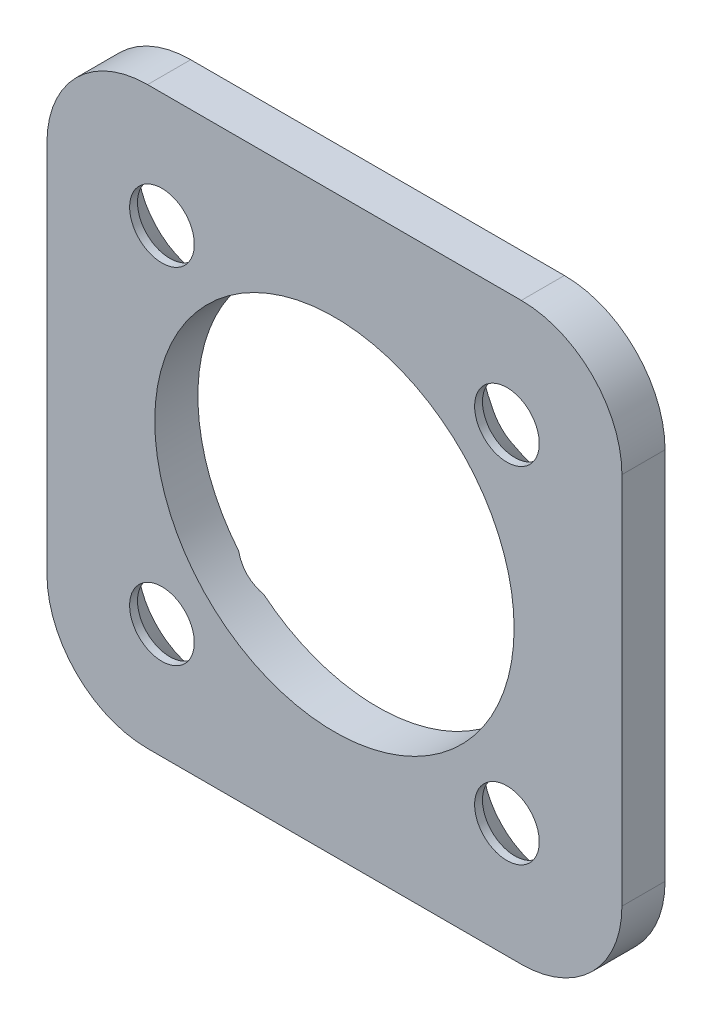
ISO-10303-21;
HEADER;
FILE_DESCRIPTION(('STEP AP214'),'2;1');
FILE_NAME('part.step','',(''),(''),'','','');
FILE_SCHEMA(('AUTOMOTIVE_DESIGN { 1 0 10303 214 1 1 1 1 }'));
ENDSEC;
DATA;
#1=APPLICATION_CONTEXT('core data for automotive mechanical design processes');
#2=APPLICATION_PROTOCOL_DEFINITION('international standard','automotive_design',2000,#1);
#3=PRODUCT_CONTEXT('',#1,'mechanical');
#4=PRODUCT('Part','Part','',(#3));
#5=PRODUCT_RELATED_PRODUCT_CATEGORY('part','',(#4));
#6=PRODUCT_DEFINITION_FORMATION('','',#4);
#7=PRODUCT_DEFINITION_CONTEXT('part definition',#1,'design');
#8=PRODUCT_DEFINITION('design','',#6,#7);
#9=PRODUCT_DEFINITION_SHAPE('','',#8);
#10=(LENGTH_UNIT() NAMED_UNIT(*) SI_UNIT(.MILLI.,.METRE.));
#11=(NAMED_UNIT(*) PLANE_ANGLE_UNIT() SI_UNIT($,.RADIAN.));
#12=(NAMED_UNIT(*) SI_UNIT($,.STERADIAN.) SOLID_ANGLE_UNIT());
#13=UNCERTAINTY_MEASURE_WITH_UNIT(LENGTH_MEASURE(1.E-05),#10,'distance_accuracy_value','');
#14=(GEOMETRIC_REPRESENTATION_CONTEXT(3) GLOBAL_UNCERTAINTY_ASSIGNED_CONTEXT((#13)) GLOBAL_UNIT_ASSIGNED_CONTEXT((#10,
#11,#12)) REPRESENTATION_CONTEXT('',''));
#15=CARTESIAN_POINT('',(0.,0.,0.));
#16=DIRECTION('',(0.,0.,1.));
#17=DIRECTION('',(1.,0.,0.));
#18=AXIS2_PLACEMENT_3D('',#15,#16,#17);
#19=CARTESIAN_POINT('',(0.,0.,0.));
#20=DIRECTION('',(0.,0.,1.));
#21=DIRECTION('',(1.,0.,0.));
#22=AXIS2_PLACEMENT_3D('',#19,#20,#21);
#23=PLANE('',#22);
#24=DIRECTION('',(0.,1.,0.));
#25=VECTOR('',#24,1.);
#26=CARTESIAN_POINT('',(-20.,0.,0.));
#27=LINE('',#26,#25);
#28=CARTESIAN_POINT('',(-20.,-13.,0.));
#29=VERTEX_POINT('',#28);
#30=CARTESIAN_POINT('',(-20.,13.,0.));
#31=VERTEX_POINT('',#30);
#32=EDGE_CURVE('E170',#29,#31,#27,.T.);
#33=ORIENTED_EDGE('',*,*,#32,.T.);
#34=CARTESIAN_POINT('',(-13.,13.,0.));
#35=DIRECTION('',(0.,0.,1.));
#36=DIRECTION('',(1.,0.,0.));
#37=AXIS2_PLACEMENT_3D('',#34,#35,#36);
#38=CIRCLE('',#37,7.);
#39=CARTESIAN_POINT('',(-13.,20.,0.));
#40=VERTEX_POINT('',#39);
#41=EDGE_CURVE('E191',#31,#40,#38,.F.);
#42=ORIENTED_EDGE('',*,*,#41,.T.);
#43=DIRECTION('',(1.,0.,0.));
#44=VECTOR('',#43,1.);
#45=CARTESIAN_POINT('',(0.,20.,0.));
#46=LINE('',#45,#44);
#47=CARTESIAN_POINT('',(13.,20.,0.));
#48=VERTEX_POINT('',#47);
#49=EDGE_CURVE('E166',#40,#48,#46,.T.);
#50=ORIENTED_EDGE('',*,*,#49,.T.);
#51=CARTESIAN_POINT('',(13.,13.,0.));
#52=DIRECTION('',(0.,0.,1.));
#53=DIRECTION('',(1.,0.,0.));
#54=AXIS2_PLACEMENT_3D('',#51,#52,#53);
#55=CIRCLE('',#54,7.);
#56=CARTESIAN_POINT('',(20.,13.,0.));
#57=VERTEX_POINT('',#56);
#58=EDGE_CURVE('E182',#48,#57,#55,.F.);
#59=ORIENTED_EDGE('',*,*,#58,.T.);
#60=DIRECTION('',(0.,1.,0.));
#61=VECTOR('',#60,1.);
#62=CARTESIAN_POINT('',(20.,0.,0.));
#63=LINE('',#62,#61);
#64=CARTESIAN_POINT('',(20.,-13.,0.));
#65=VERTEX_POINT('',#64);
#66=EDGE_CURVE('E162',#65,#57,#63,.T.);
#67=ORIENTED_EDGE('',*,*,#66,.F.);
#68=CARTESIAN_POINT('',(13.,-13.,0.));
#69=DIRECTION('',(0.,0.,1.));
#70=DIRECTION('',(1.,0.,0.));
#71=AXIS2_PLACEMENT_3D('',#68,#69,#70);
#72=CIRCLE('',#71,7.);
#73=CARTESIAN_POINT('',(13.,-20.,0.));
#74=VERTEX_POINT('',#73);
#75=EDGE_CURVE('E185',#65,#74,#72,.F.);
#76=ORIENTED_EDGE('',*,*,#75,.T.);
#77=DIRECTION('',(1.,0.,0.));
#78=VECTOR('',#77,1.);
#79=CARTESIAN_POINT('',(0.,-20.,0.));
#80=LINE('',#79,#78);
#81=CARTESIAN_POINT('',(-13.,-20.,0.));
#82=VERTEX_POINT('',#81);
#83=EDGE_CURVE('E153',#82,#74,#80,.T.);
#84=ORIENTED_EDGE('',*,*,#83,.F.);
#85=CARTESIAN_POINT('',(-13.,-13.,0.));
#86=DIRECTION('',(0.,0.,1.));
#87=DIRECTION('',(1.,0.,0.));
#88=AXIS2_PLACEMENT_3D('',#85,#86,#87);
#89=CIRCLE('',#88,7.);
#90=EDGE_CURVE('E188',#82,#29,#89,.F.);
#91=ORIENTED_EDGE('',*,*,#90,.T.);
#92=EDGE_LOOP('',(#33,#42,#50,#59,#67,#76,#84,#91));
#93=FACE_BOUND('',#92,.T.);
#94=CARTESIAN_POINT('',(0.,0.,0.));
#95=DIRECTION('',(0.,0.,1.));
#96=DIRECTION('',(1.,0.,0.));
#97=AXIS2_PLACEMENT_3D('',#94,#95,#96);
#98=CIRCLE('',#97,12.5);
#99=CARTESIAN_POINT('',(9.67418996809564,-7.91581003190437,0.));
#100=VERTEX_POINT('',#99);
#101=CARTESIAN_POINT('',(9.67418996809562,7.91581003190438,0.));
#102=VERTEX_POINT('',#101);
#103=EDGE_CURVE('E140',#100,#102,#98,.T.);
#104=ORIENTED_EDGE('',*,*,#103,.T.);
#105=CARTESIAN_POINT('',(12.,12.,0.));
#106=DIRECTION('',(0.,0.,-1.));
#107=DIRECTION('',(-1.,0.,0.));
#108=AXIS2_PLACEMENT_3D('',#105,#106,#107);
#109=CIRCLE('',#108,4.7);
#110=CARTESIAN_POINT('',(7.91581003190437,9.67418996809564,0.));
#111=VERTEX_POINT('',#110);
#112=EDGE_CURVE('E61',#111,#102,#109,.T.);
#113=ORIENTED_EDGE('',*,*,#112,.F.);
#114=CARTESIAN_POINT('',(-7.91581003190436,9.67418996809564,0.));
#115=VERTEX_POINT('',#114);
#116=EDGE_CURVE('E68',#111,#115,#98,.T.);
#117=ORIENTED_EDGE('',*,*,#116,.T.);
#118=CARTESIAN_POINT('',(-12.,12.,0.));
#119=DIRECTION('',(0.,0.,-1.));
#120=DIRECTION('',(-1.,0.,0.));
#121=AXIS2_PLACEMENT_3D('',#118,#119,#120);
#122=CIRCLE('',#121,4.7);
#123=CARTESIAN_POINT('',(-9.67418996809565,7.91581003190435,0.));
#124=VERTEX_POINT('',#123);
#125=EDGE_CURVE('E354',#124,#115,#122,.T.);
#126=ORIENTED_EDGE('',*,*,#125,.F.);
#127=CARTESIAN_POINT('',(-9.67418996809564,-7.91581003190436,0.));
#128=VERTEX_POINT('',#127);
#129=EDGE_CURVE('E149',#124,#128,#98,.T.);
#130=ORIENTED_EDGE('',*,*,#129,.T.);
#131=CARTESIAN_POINT('',(-12.,-12.,0.));
#132=DIRECTION('',(0.,0.,-1.));
#133=DIRECTION('',(-1.,0.,0.));
#134=AXIS2_PLACEMENT_3D('',#131,#132,#133);
#135=CIRCLE('',#134,4.7);
#136=CARTESIAN_POINT('',(-7.91581003190435,-9.67418996809565,0.));
#137=VERTEX_POINT('',#136);
#138=EDGE_CURVE('E342',#137,#128,#135,.T.);
#139=ORIENTED_EDGE('',*,*,#138,.F.);
#140=CARTESIAN_POINT('',(7.91581003190437,-9.67418996809563,0.));
#141=VERTEX_POINT('',#140);
#142=EDGE_CURVE('E154',#137,#141,#98,.T.);
#143=ORIENTED_EDGE('',*,*,#142,.T.);
#144=CARTESIAN_POINT('',(12.,-12.,0.));
#145=DIRECTION('',(0.,0.,-1.));
#146=DIRECTION('',(-1.,0.,0.));
#147=AXIS2_PLACEMENT_3D('',#144,#145,#146);
#148=CIRCLE('',#147,4.7);
#149=EDGE_CURVE('E330',#100,#141,#148,.T.);
#150=ORIENTED_EDGE('',*,*,#149,.F.);
#151=EDGE_LOOP('',(#104,#113,#117,#126,#130,#139,#143,#150));
#152=FACE_BOUND('',#151,.T.);
#153=ADVANCED_FACE('F41',(#93,#152),#23,.F.);
#154=CARTESIAN_POINT('',(0.,-20.,3.));
#155=DIRECTION('',(0.,1.,0.));
#156=DIRECTION('',(0.,0.,1.));
#157=AXIS2_PLACEMENT_3D('',#154,#155,#156);
#158=PLANE('',#157);
#159=DIRECTION('',(1.,0.,0.));
#160=VECTOR('',#159,1.);
#161=CARTESIAN_POINT('',(0.,-20.,3.));
#162=LINE('',#161,#160);
#163=CARTESIAN_POINT('',(-13.,-20.,3.));
#164=VERTEX_POINT('',#163);
#165=CARTESIAN_POINT('',(13.,-20.,3.));
#166=VERTEX_POINT('',#165);
#167=EDGE_CURVE('E281',#164,#166,#162,.T.);
#168=ORIENTED_EDGE('',*,*,#167,.F.);
#169=DIRECTION('',(0.,0.,-1.));
#170=VECTOR('',#169,1.);
#171=CARTESIAN_POINT('',(-13.,-20.,0.));
#172=LINE('',#171,#170);
#173=EDGE_CURVE('E216',#164,#82,#172,.T.);
#174=ORIENTED_EDGE('',*,*,#173,.T.);
#175=ORIENTED_EDGE('',*,*,#83,.T.);
#176=DIRECTION('',(0.,0.,-1.));
#177=VECTOR('',#176,1.);
#178=CARTESIAN_POINT('',(13.,-20.,3.));
#179=LINE('',#178,#177);
#180=EDGE_CURVE('E213',#74,#166,#179,.F.);
#181=ORIENTED_EDGE('',*,*,#180,.T.);
#182=EDGE_LOOP('',(#168,#174,#175,#181));
#183=FACE_BOUND('',#182,.T.);
#184=ADVANCED_FACE('F263',(#183),#158,.F.);
#185=CARTESIAN_POINT('',(20.,0.,3.));
#186=DIRECTION('',(-1.,0.,0.));
#187=DIRECTION('',(0.,0.,1.));
#188=AXIS2_PLACEMENT_3D('',#185,#186,#187);
#189=PLANE('',#188);
#190=DIRECTION('',(0.,1.,0.));
#191=VECTOR('',#190,1.);
#192=CARTESIAN_POINT('',(20.,0.,3.));
#193=LINE('',#192,#191);
#194=CARTESIAN_POINT('',(20.,-13.,3.));
#195=VERTEX_POINT('',#194);
#196=CARTESIAN_POINT('',(20.,13.,3.));
#197=VERTEX_POINT('',#196);
#198=EDGE_CURVE('E288',#195,#197,#193,.T.);
#199=ORIENTED_EDGE('',*,*,#198,.F.);
#200=DIRECTION('',(0.,0.,-1.));
#201=VECTOR('',#200,1.);
#202=CARTESIAN_POINT('',(20.,-13.,3.));
#203=LINE('',#202,#201);
#204=EDGE_CURVE('E223',#195,#65,#203,.T.);
#205=ORIENTED_EDGE('',*,*,#204,.T.);
#206=ORIENTED_EDGE('',*,*,#66,.T.);
#207=DIRECTION('',(0.,0.,-1.));
#208=VECTOR('',#207,1.);
#209=CARTESIAN_POINT('',(20.,13.,3.));
#210=LINE('',#209,#208);
#211=EDGE_CURVE('E220',#57,#197,#210,.F.);
#212=ORIENTED_EDGE('',*,*,#211,.T.);
#213=EDGE_LOOP('',(#199,#205,#206,#212));
#214=FACE_BOUND('',#213,.T.);
#215=ADVANCED_FACE('F271',(#214),#189,.F.);
#216=CARTESIAN_POINT('',(0.,20.,3.));
#217=DIRECTION('',(0.,1.,0.));
#218=DIRECTION('',(0.,0.,1.));
#219=AXIS2_PLACEMENT_3D('',#216,#217,#218);
#220=PLANE('',#219);
#221=ORIENTED_EDGE('',*,*,#49,.F.);
#222=DIRECTION('',(0.,0.,-1.));
#223=VECTOR('',#222,1.);
#224=CARTESIAN_POINT('',(-13.,20.,3.));
#225=LINE('',#224,#223);
#226=CARTESIAN_POINT('',(-13.,20.,3.));
#227=VERTEX_POINT('',#226);
#228=EDGE_CURVE('E198',#40,#227,#225,.F.);
#229=ORIENTED_EDGE('',*,*,#228,.T.);
#230=DIRECTION('',(1.,0.,0.));
#231=VECTOR('',#230,1.);
#232=CARTESIAN_POINT('',(0.,20.,3.));
#233=LINE('',#232,#231);
#234=CARTESIAN_POINT('',(13.,20.,3.));
#235=VERTEX_POINT('',#234);
#236=EDGE_CURVE('E305',#227,#235,#233,.T.);
#237=ORIENTED_EDGE('',*,*,#236,.T.);
#238=DIRECTION('',(0.,0.,-1.));
#239=VECTOR('',#238,1.);
#240=CARTESIAN_POINT('',(13.,20.,0.));
#241=LINE('',#240,#239);
#242=EDGE_CURVE('E194',#235,#48,#241,.T.);
#243=ORIENTED_EDGE('',*,*,#242,.T.);
#244=EDGE_LOOP('',(#221,#229,#237,#243));
#245=FACE_BOUND('',#244,.T.);
#246=ADVANCED_FACE('F268',(#245),#220,.T.);
#247=CARTESIAN_POINT('',(0.,0.,3.));
#248=DIRECTION('',(0.,0.,-1.));
#249=DIRECTION('',(-1.,0.,0.));
#250=AXIS2_PLACEMENT_3D('',#247,#248,#249);
#251=CYLINDRICAL_SURFACE('',#250,12.5);
#252=CARTESIAN_POINT('',(10.8006047846748,6.29260965619672,-1.13205396229184));
#253=CARTESIAN_POINT('',(10.7645172292087,6.35454761223525,-1.07886654106556));
#254=CARTESIAN_POINT('',(10.7276604779168,6.41658620080491,-1.02632212757593));
#255=CARTESIAN_POINT('',(10.6522958441881,6.54093932193887,-0.922725032695068));
#256=CARTESIAN_POINT('',(10.6137875103378,6.60325392571683,-0.871672765634166));
#257=CARTESIAN_POINT('',(10.4952550795433,6.79129330640606,-0.720607779526519));
#258=CARTESIAN_POINT('',(10.4125800478102,6.91749930457328,-0.623219889186378));
#259=CARTESIAN_POINT('',(10.2400977072329,7.17032889068553,-0.438888652324929));
#260=CARTESIAN_POINT('',(10.1503645429114,7.29693746721305,-0.351855934719834));
#261=CARTESIAN_POINT('',(9.96223494712116,7.55174402889875,-0.190905891144072));
#262=CARTESIAN_POINT('',(9.86386003391623,7.67993741952499,-0.116957297053382));
#263=CARTESIAN_POINT('',(9.73241664500092,7.84424265007866,-0.033973245157395));
#264=CARTESIAN_POINT('',(9.70366995167949,7.87977970409186,-0.0167234618062224));
#265=CARTESIAN_POINT('',(9.55693054819715,8.05912407480012,0.0665191467279399));
#266=CARTESIAN_POINT('',(9.43311103608502,8.20388608625827,0.121396218316169));
#267=CARTESIAN_POINT('',(9.2392452401968,8.41996277323248,0.180112268994139));
#268=CARTESIAN_POINT('',(9.17323507635609,8.49184333589452,0.195752777982601));
#269=CARTESIAN_POINT('',(9.03883776209829,8.6347559452018,0.218495263505952));
#270=CARTESIAN_POINT('',(8.97045104923066,8.70578814483821,0.225598803313324));
#271=CARTESIAN_POINT('',(8.83152776375289,8.84669175364472,0.230912959288517));
#272=CARTESIAN_POINT('',(8.76098287354356,8.9165564678845,0.229083249510996));
#273=CARTESIAN_POINT('',(8.61864915044469,9.05420842154312,0.216535244463097));
#274=CARTESIAN_POINT('',(8.5468600796403,9.12199525660842,0.205815230391567));
#275=CARTESIAN_POINT('',(8.40269099310056,9.25496636466527,0.176014739641296));
#276=CARTESIAN_POINT('',(8.33031121259788,9.32015161805615,0.15693744546944));
#277=CARTESIAN_POINT('',(8.18541971590156,9.44765677551576,0.111243867083364));
#278=CARTESIAN_POINT('',(8.1129080001486,9.50997668913708,0.0846276080050394));
#279=CARTESIAN_POINT('',(8.01963397280548,9.58833753332281,0.0461029241292335));
#280=CARTESIAN_POINT('',(7.99875125529021,9.60576459594413,0.0372000670154303));
#281=CARTESIAN_POINT('',(7.95703437163372,9.64034942818812,0.0188812289150323));
#282=CARTESIAN_POINT('',(7.93620017729589,9.65750749493711,0.00946587431207679));
#283=CARTESIAN_POINT('',(7.80422426483353,9.76548547980875,-0.0518020888920344));
#284=CARTESIAN_POINT('',(7.69344435594022,9.8529218449894,-0.110544111463963));
#285=CARTESIAN_POINT('',(7.47301837942981,10.0211418637569,-0.239057454103525));
#286=CARTESIAN_POINT('',(7.36337492063897,10.1019123167037,-0.308849896322763));
#287=CARTESIAN_POINT('',(7.14451278579196,10.2578812798489,-0.45733413510473));
#288=CARTESIAN_POINT('',(7.03530416636305,10.3330311827916,-0.536091365536578));
#289=CARTESIAN_POINT('',(6.87256513782397,10.4413633864377,-0.65886078669061));
#290=CARTESIAN_POINT('',(6.81860419393717,10.4766760187053,-0.700468739083402));
#291=CARTESIAN_POINT('',(6.71094124331328,10.545964164327,-0.785076273703849));
#292=CARTESIAN_POINT('',(6.65723917598595,10.5799400053682,-0.828075510117313));
#293=CARTESIAN_POINT('',(6.60364071568188,10.6132902201998,-0.871683546186012));
#294=B_SPLINE_CURVE_WITH_KNOTS('',3,(#252,#253,#254,#255,#256,#257,#258,#259,#260,#261,#262,
#263,#264,#265,#266,#267,#268,#269,#270,#271,#272,#273,#274,#275,#276,#277,#278,#279,#280,#281,
#282,#283,#284,#285,#286,#287,#288,#289,#290,#291,#292,#293),.UNSPECIFIED.,.F.,.F.,(4,2,2,2,2,2,
2,2,2,2,2,2,2,2,2,2,2,2,2,2,4),(0.,0.267769444558758,0.535612548663542,1.0739597192657,
1.60725907509447,2.13926622603962,2.2858391566638,2.8776776575702,3.1738687207185,
3.47000553769171,3.76748039061873,4.06501276906259,4.36243194358922,4.65985012649311,
4.74570428330606,4.83145576614648,5.2892473219753,5.74792472159905,6.21019537634768,
6.44041543203432,6.6705786978434),.UNSPECIFIED.);
#295=EDGE_CURVE('E11',#102,#111,#294,.T.);
#296=ORIENTED_EDGE('',*,*,#295,.F.);
#297=ORIENTED_EDGE('',*,*,#103,.F.);
#298=CARTESIAN_POINT('',(6.29260965619673,-10.8006047846748,-1.13205396229184));
#299=CARTESIAN_POINT('',(6.35454761223525,-10.7645172292087,-1.07886654106556));
#300=CARTESIAN_POINT('',(6.41658620080491,-10.7276604779168,-1.02632212757593));
#301=CARTESIAN_POINT('',(6.54093932193887,-10.6522958441881,-0.922725032695074));
#302=CARTESIAN_POINT('',(6.60325392571682,-10.6137875103378,-0.871672765634173));
#303=CARTESIAN_POINT('',(6.79129330640605,-10.4952550795433,-0.72060777952653));
#304=CARTESIAN_POINT('',(6.91749930457326,-10.4125800478103,-0.623219889186392));
#305=CARTESIAN_POINT('',(7.17032889068551,-10.2400977072329,-0.438888652324943));
#306=CARTESIAN_POINT('',(7.29693746721303,-10.1503645429114,-0.351855934719844));
#307=CARTESIAN_POINT('',(7.55174402889874,-9.96223494712117,-0.190905891144075));
#308=CARTESIAN_POINT('',(7.67993741952499,-9.86386003391623,-0.11695729705338));
#309=CARTESIAN_POINT('',(7.84424265007917,-9.73241664500051,-0.0339732451571383));
#310=CARTESIAN_POINT('',(7.87977970409287,-9.70366995167867,-0.0167234618057314));
#311=CARTESIAN_POINT('',(8.05912407480158,-9.55693054819591,0.0665191467285314));
#312=CARTESIAN_POINT('',(8.20388608625967,-9.4331110360838,0.121396218316646));
#313=CARTESIAN_POINT('',(8.41996277323378,-9.23924524019561,0.180112268994445));
#314=CARTESIAN_POINT('',(8.49184333589579,-9.17323507635491,0.195752777982851));
#315=CARTESIAN_POINT('',(8.63475594520299,-9.03883776209715,0.218495263506095));
#316=CARTESIAN_POINT('',(8.70578814483936,-8.97045104922954,0.225598803313416));
#317=CARTESIAN_POINT('',(8.8466917536458,-8.83152776375181,0.230912959288514));
#318=CARTESIAN_POINT('',(8.91655646788554,-8.7609828735425,0.229083249510948));
#319=CARTESIAN_POINT('',(9.05420842154407,-8.61864915044369,0.216535244462969));
#320=CARTESIAN_POINT('',(9.12199525660933,-8.54686007963932,0.205815230391403));
#321=CARTESIAN_POINT('',(9.2549663646661,-8.40269099309964,0.176014739641073));
#322=CARTESIAN_POINT('',(9.32015161805694,-8.330311212597,0.156937445469193));
#323=CARTESIAN_POINT('',(9.44765677551646,-8.18541971590074,0.111243867083081));
#324=CARTESIAN_POINT('',(9.50997668913775,-8.11290800014782,0.0846276080047441));
#325=CARTESIAN_POINT('',(9.58833753332312,-8.01963397280511,0.0461029241290772));
#326=CARTESIAN_POINT('',(9.60576459594412,-7.99875125529022,0.0372000670154328));
#327=CARTESIAN_POINT('',(9.64034942818749,-7.95703437163447,0.018881228915372));
#328=CARTESIAN_POINT('',(9.65750749493618,-7.93620017729703,0.00946587431259486));
#329=CARTESIAN_POINT('',(9.76548547980765,-7.80422426483493,-0.0518020888913197));
#330=CARTESIAN_POINT('',(9.85292184498842,-7.69344435594149,-0.110544111463262));
#331=CARTESIAN_POINT('',(10.0211418637561,-7.47301837943083,-0.239057454102888));
#332=CARTESIAN_POINT('',(10.101912316703,-7.36337492063986,-0.308849896322177));
#333=CARTESIAN_POINT('',(10.2578812798484,-7.14451278579259,-0.457334135104275));
#334=CARTESIAN_POINT('',(10.3330311827912,-7.03530416636355,-0.536091365536203));
#335=CARTESIAN_POINT('',(10.4413633864375,-6.87256513782428,-0.658860786690367));
#336=CARTESIAN_POINT('',(10.4766760187051,-6.81860419393742,-0.700468739083205));
#337=CARTESIAN_POINT('',(10.545964164327,-6.7109412433134,-0.785076273703746));
#338=CARTESIAN_POINT('',(10.5799400053682,-6.65723917598601,-0.828075510117259));
#339=CARTESIAN_POINT('',(10.6132902201998,-6.60364071568188,-0.871683546186009));
#340=B_SPLINE_CURVE_WITH_KNOTS('',3,(#298,#299,#300,#301,#302,#303,#304,#305,#306,#307,#308,
#309,#310,#311,#312,#313,#314,#315,#316,#317,#318,#319,#320,#321,#322,#323,#324,#325,#326,#327,
#328,#329,#330,#331,#332,#333,#334,#335,#336,#337,#338,#339),.UNSPECIFIED.,.F.,.F.,(4,2,2,2,2,2,
2,2,2,2,2,2,2,2,2,2,2,2,2,2,4),(0.,0.267769444558748,0.535612548663522,1.07395971926567,
1.60725907509445,2.13926622603962,2.28583915666588,2.87767765757203,3.17386872072019,
3.47000553769328,3.76748039062016,4.06501276906388,4.36243194359038,4.65985012649413,
4.74570428330553,4.8314557661444,5.28924732197372,5.74792472159797,6.21019537634715,
6.44041543203405,6.6705786978434),.UNSPECIFIED.);
#341=EDGE_CURVE('E227',#141,#100,#340,.T.);
#342=ORIENTED_EDGE('',*,*,#341,.F.);
#343=ORIENTED_EDGE('',*,*,#142,.F.);
#344=CARTESIAN_POINT('',(-10.8006047846748,-6.29260965619672,-1.13205396229184));
#345=CARTESIAN_POINT('',(-10.7645172292087,-6.35454761223525,-1.07886654106556));
#346=CARTESIAN_POINT('',(-10.7276604779168,-6.41658620080491,-1.02632212757593));
#347=CARTESIAN_POINT('',(-10.6522958441881,-6.54093932193886,-0.922725032695071));
#348=CARTESIAN_POINT('',(-10.6137875103378,-6.60325392571682,-0.87167276563417));
#349=CARTESIAN_POINT('',(-10.4952550795433,-6.79129330640605,-0.720607779526527));
#350=CARTESIAN_POINT('',(-10.4125800478103,-6.91749930457325,-0.62321988918639));
#351=CARTESIAN_POINT('',(-10.2400977072329,-7.1703288906855,-0.438888652324939));
#352=CARTESIAN_POINT('',(-10.1503645429114,-7.29693746721303,-0.351855934719839));
#353=CARTESIAN_POINT('',(-9.96223494712117,-7.55174402889874,-0.19090589114407));
#354=CARTESIAN_POINT('',(-9.86386003391623,-7.67993741952499,-0.116957297053377));
#355=CARTESIAN_POINT('',(-9.73241664500052,-7.84424265007916,-0.0339732451571359));
#356=CARTESIAN_POINT('',(-9.70366995167868,-7.87977970409286,-0.01672346180573));
#357=CARTESIAN_POINT('',(-9.55693054819593,-8.05912407480157,0.0665191467285333));
#358=CARTESIAN_POINT('',(-9.43311103608381,-8.20388608625966,0.121396218316649));
#359=CARTESIAN_POINT('',(-9.23924524019562,-8.41996277323377,0.180112268994449));
#360=CARTESIAN_POINT('',(-9.17323507635492,-8.49184333589577,0.195752777982855));
#361=CARTESIAN_POINT('',(-9.03883776209716,-8.63475594520298,0.218495263506101));
#362=CARTESIAN_POINT('',(-8.97045104922955,-8.70578814483935,0.225598803313424));
#363=CARTESIAN_POINT('',(-8.83152776375182,-8.84669175364579,0.230912959288523));
#364=CARTESIAN_POINT('',(-8.76098287354251,-8.91655646788553,0.229083249510956));
#365=CARTESIAN_POINT('',(-8.6186491504437,-9.05420842154406,0.216535244462978));
#366=CARTESIAN_POINT('',(-8.54686007963933,-9.12199525660933,0.205815230391412));
#367=CARTESIAN_POINT('',(-8.40269099309965,-9.25496636466609,0.176014739641083));
#368=CARTESIAN_POINT('',(-8.33031121259701,-9.32015161805693,0.156937445469202));
#369=CARTESIAN_POINT('',(-8.18541971590075,-9.44765677551645,0.11124386708309));
#370=CARTESIAN_POINT('',(-8.11290800014782,-9.50997668913774,0.0846276080047517));
#371=CARTESIAN_POINT('',(-8.01963397280512,-9.58833753332311,0.0461029241290847));
#372=CARTESIAN_POINT('',(-7.99875125529022,-9.60576459594413,0.0372000670154392));
#373=CARTESIAN_POINT('',(-7.95703437163447,-9.6403494281875,0.0188812289153757));
#374=CARTESIAN_POINT('',(-7.93620017729702,-9.65750749493619,0.00946587431259699));
#375=CARTESIAN_POINT('',(-7.80422426483491,-9.76548547980766,-0.0518020888913176));
#376=CARTESIAN_POINT('',(-7.69344435594148,-9.85292184498843,-0.11054411146326));
#377=CARTESIAN_POINT('',(-7.47301837943082,-10.0211418637561,-0.239057454102885));
#378=CARTESIAN_POINT('',(-7.36337492063986,-10.101912316703,-0.308849896322172));
#379=CARTESIAN_POINT('',(-7.1445127857926,-10.2578812798484,-0.457334135104267));
#380=CARTESIAN_POINT('',(-7.03530416636355,-10.3330311827912,-0.536091365536194));
#381=CARTESIAN_POINT('',(-6.87256513782428,-10.4413633864375,-0.658860786690358));
#382=CARTESIAN_POINT('',(-6.81860419393743,-10.4766760187051,-0.700468739083194));
#383=CARTESIAN_POINT('',(-6.71094124331341,-10.545964164327,-0.785076273703735));
#384=CARTESIAN_POINT('',(-6.65723917598602,-10.5799400053682,-0.828075510117248));
#385=CARTESIAN_POINT('',(-6.60364071568189,-10.6132902201998,-0.871683546185998));
#386=B_SPLINE_CURVE_WITH_KNOTS('',3,(#344,#345,#346,#347,#348,#349,#350,#351,#352,#353,#354,
#355,#356,#357,#358,#359,#360,#361,#362,#363,#364,#365,#366,#367,#368,#369,#370,#371,#372,#373,
#374,#375,#376,#377,#378,#379,#380,#381,#382,#383,#384,#385),.UNSPECIFIED.,.F.,.F.,(4,2,2,2,2,2,
2,2,2,2,2,2,2,2,2,2,2,2,2,2,4),(0.,0.26776944455875,0.535612548663525,1.07395971926567,
1.60725907509445,2.13926622603962,2.28583915666587,2.87767765757201,3.17386872072018,
3.47000553769327,3.76748039062015,4.06501276906388,4.36243194359037,4.65985012649413,
4.74570428330554,4.83145576614443,5.28924732197373,5.74792472159798,6.21019537634715,
6.44041543203405,6.6705786978434),.UNSPECIFIED.);
#387=EDGE_CURVE('E235',#128,#137,#386,.T.);
#388=ORIENTED_EDGE('',*,*,#387,.F.);
#389=ORIENTED_EDGE('',*,*,#129,.F.);
#390=CARTESIAN_POINT('',(-6.60364071568189,10.6132902201998,-0.871683546185998));
#391=CARTESIAN_POINT('',(-6.65648309257449,10.5804105275721,-0.828690482268786));
#392=CARTESIAN_POINT('',(-6.70942657567931,10.5469223813527,-0.786289101982085));
#393=CARTESIAN_POINT('',(-6.81556344746717,10.4786488326951,-0.702836694597583));
#394=CARTESIAN_POINT('',(-6.86875688853872,10.4438631466412,-0.661785966459064));
#395=CARTESIAN_POINT('',(-7.0291338317676,10.3372052099081,-0.540647555309464));
#396=CARTESIAN_POINT('',(-7.13673289258125,10.263268424003,-0.46288669755904));
#397=CARTESIAN_POINT('',(-7.35547838934832,10.1076868850598,-0.313950042668184));
#398=CARTESIAN_POINT('',(-7.46665178386171,10.0259124720208,-0.242947679699083));
#399=CARTESIAN_POINT('',(-7.69020339110584,9.85547936469637,-0.112263411727003));
#400=CARTESIAN_POINT('',(-7.80257952152483,9.76683129631872,-0.0525645059133385));
#401=CARTESIAN_POINT('',(-7.98755793817569,9.61548831302981,0.0333072689453376));
#402=CARTESIAN_POINT('',(-8.05991013513959,9.55494340402944,0.0638114459492611));
#403=CARTESIAN_POINT('',(-8.20471866090258,9.43088947544502,0.117845992881713));
#404=CARTESIAN_POINT('',(-8.27717499240459,9.36738037752488,0.141376178384161));
#405=CARTESIAN_POINT('',(-8.4212546169749,9.23806100681818,0.180397548125066));
#406=CARTESIAN_POINT('',(-8.49288016465709,9.17227039389944,0.195944911608852));
#407=CARTESIAN_POINT('',(-8.6352745766849,9.03833956726141,0.218550412560006));
#408=CARTESIAN_POINT('',(-8.70604352843981,8.97019959605466,0.225609423554922));
#409=CARTESIAN_POINT('',(-8.84664276180074,8.83157572334244,0.230910115681913));
#410=CARTESIAN_POINT('',(-8.91646205930959,8.76107809951336,0.229085433520706));
#411=CARTESIAN_POINT('',(-9.05402139685334,8.61884492541822,0.216558704276857));
#412=CARTESIAN_POINT('',(-9.12176113645749,8.54710919860207,0.205855380710107));
#413=CARTESIAN_POINT('',(-9.25473395670787,8.40294767768801,0.176079113787939));
#414=CARTESIAN_POINT('',(-9.31996451384077,8.33052127581736,0.156997972379072));
#415=CARTESIAN_POINT('',(-9.44756162742581,8.18553038727254,0.111284478892811));
#416=CARTESIAN_POINT('',(-9.50992785211949,8.1129658856117,0.0846512546529946));
#417=CARTESIAN_POINT('',(-9.60586940753196,7.99876567536752,0.0374839064127333));
#418=CARTESIAN_POINT('',(-9.64045259335995,7.95704567788027,0.019143244762254));
#419=CARTESIAN_POINT('',(-9.773380053265,7.79457462675045,-0.0562822027400511));
#420=CARTESIAN_POINT('',(-9.86807127116196,7.67421949286466,-0.12079215959718));
#421=CARTESIAN_POINT('',(-10.0495918323108,7.43493987077943,-0.262485490505353));
#422=CARTESIAN_POINT('',(-10.1364089872238,7.31601783953233,-0.339688008982758));
#423=CARTESIAN_POINT('',(-10.3031920080088,7.07921440509509,-0.503749139626326));
#424=CARTESIAN_POINT('',(-10.3831304160567,6.96133871739857,-0.590643534457893));
#425=CARTESIAN_POINT('',(-10.5365331945134,6.7268925211102,-0.771375200047997));
#426=CARTESIAN_POINT('',(-10.6100013467582,6.61032128532682,-0.865208355326412));
#427=CARTESIAN_POINT('',(-10.7010996933186,6.46049682633936,-0.989681299072999));
#428=CARTESIAN_POINT('',(-10.721362028711,6.42681324485396,-1.01791957366328));
#429=CARTESIAN_POINT('',(-10.7613589181505,6.35961318073734,-1.07472703808372));
#430=CARTESIAN_POINT('',(-10.7810948306446,6.32609649668098,-1.1032950328399));
#431=CARTESIAN_POINT('',(-10.8006047846748,6.29260965619672,-1.13205396229183));
#432=B_SPLINE_CURVE_WITH_KNOTS('',3,(#390,#391,#392,#393,#394,#395,#396,#397,#398,#399,#400,
#401,#402,#403,#404,#405,#406,#407,#408,#409,#410,#411,#412,#413,#414,#415,#416,#417,#418,#419,
#420,#421,#422,#423,#424,#425,#426,#427,#428,#429,#430,#431),.UNSPECIFIED.,.F.,.F.,(4,2,2,2,2,2,
2,2,2,2,2,2,2,2,2,2,2,2,2,2,4),(0.,0.226917936639701,0.453885766940444,0.909460064498366,
1.37464095258264,1.83911653520639,2.13632755618446,2.43354643615889,2.72864393206697,
3.02371105719824,3.32098577090798,3.61830323127364,3.91591228018489,4.21355571288429,
4.38515252990949,4.88266613738527,5.38093715682042,5.88111283329582,6.38099419164863,
6.52619177623077,6.67096889379309),.UNSPECIFIED.);
#433=EDGE_CURVE('E56',#115,#124,#432,.T.);
#434=ORIENTED_EDGE('',*,*,#433,.F.);
#435=ORIENTED_EDGE('',*,*,#116,.F.);
#436=EDGE_LOOP('',(#296,#297,#342,#343,#388,#389,#434,#435));
#437=FACE_BOUND('',#436,.T.);
#438=CARTESIAN_POINT('',(0.,0.,3.));
#439=DIRECTION('',(0.,0.,1.));
#440=DIRECTION('',(1.,0.,0.));
#441=AXIS2_PLACEMENT_3D('',#438,#439,#440);
#442=CIRCLE('',#441,12.5);
#443=CARTESIAN_POINT('',(12.5,0.,3.));
#444=VERTEX_POINT('',#443);
#445=EDGE_CURVE('E174',#444,#444,#442,.T.);
#446=ORIENTED_EDGE('',*,*,#445,.T.);
#447=EDGE_LOOP('',(#446));
#448=FACE_BOUND('',#447,.T.);
#449=ADVANCED_FACE('F145',(#437,#448),#251,.F.);
#450=CARTESIAN_POINT('',(-20.,0.,3.));
#451=DIRECTION('',(-1.,0.,0.));
#452=DIRECTION('',(0.,0.,1.));
#453=AXIS2_PLACEMENT_3D('',#450,#451,#452);
#454=PLANE('',#453);
#455=DIRECTION('',(0.,1.,0.));
#456=VECTOR('',#455,1.);
#457=CARTESIAN_POINT('',(-20.,0.,3.));
#458=LINE('',#457,#456);
#459=CARTESIAN_POINT('',(-20.,-13.,3.));
#460=VERTEX_POINT('',#459);
#461=CARTESIAN_POINT('',(-20.,13.,3.));
#462=VERTEX_POINT('',#461);
#463=EDGE_CURVE('E157',#460,#462,#458,.T.);
#464=ORIENTED_EDGE('',*,*,#463,.T.);
#465=DIRECTION('',(0.,0.,-1.));
#466=VECTOR('',#465,1.);
#467=CARTESIAN_POINT('',(-20.,13.,3.));
#468=LINE('',#467,#466);
#469=EDGE_CURVE('E178',#462,#31,#468,.T.);
#470=ORIENTED_EDGE('',*,*,#469,.T.);
#471=ORIENTED_EDGE('',*,*,#32,.F.);
#472=DIRECTION('',(0.,0.,-1.));
#473=VECTOR('',#472,1.);
#474=CARTESIAN_POINT('',(-20.,-13.,3.));
#475=LINE('',#474,#473);
#476=EDGE_CURVE('E175',#29,#460,#475,.F.);
#477=ORIENTED_EDGE('',*,*,#476,.T.);
#478=EDGE_LOOP('',(#464,#470,#471,#477));
#479=FACE_BOUND('',#478,.T.);
#480=ADVANCED_FACE('F259',(#479),#454,.T.);
#481=CARTESIAN_POINT('',(0.,0.,3.));
#482=DIRECTION('',(0.,0.,1.));
#483=DIRECTION('',(1.,0.,0.));
#484=AXIS2_PLACEMENT_3D('',#481,#482,#483);
#485=PLANE('',#484);
#486=CARTESIAN_POINT('',(12.,12.,3.));
#487=DIRECTION('',(0.,0.,-1.));
#488=DIRECTION('',(-1.,0.,0.));
#489=AXIS2_PLACEMENT_3D('',#486,#487,#488);
#490=CIRCLE('',#489,2.25);
#491=CARTESIAN_POINT('',(9.75000000000001,12.,3.));
#492=VERTEX_POINT('',#491);
#493=EDGE_CURVE('E357',#492,#492,#490,.T.);
#494=ORIENTED_EDGE('',*,*,#493,.T.);
#495=EDGE_LOOP('',(#494));
#496=FACE_BOUND('',#495,.T.);
#497=CARTESIAN_POINT('',(-12.,12.,3.));
#498=DIRECTION('',(0.,0.,-1.));
#499=DIRECTION('',(-1.,0.,0.));
#500=AXIS2_PLACEMENT_3D('',#497,#498,#499);
#501=CIRCLE('',#500,2.25);
#502=CARTESIAN_POINT('',(-14.25,12.,3.));
#503=VERTEX_POINT('',#502);
#504=EDGE_CURVE('E346',#503,#503,#501,.T.);
#505=ORIENTED_EDGE('',*,*,#504,.T.);
#506=EDGE_LOOP('',(#505));
#507=FACE_BOUND('',#506,.T.);
#508=CARTESIAN_POINT('',(-12.,-12.,3.));
#509=DIRECTION('',(0.,0.,-1.));
#510=DIRECTION('',(-1.,0.,0.));
#511=AXIS2_PLACEMENT_3D('',#508,#509,#510);
#512=CIRCLE('',#511,2.25);
#513=CARTESIAN_POINT('',(-14.25,-12.,3.));
#514=VERTEX_POINT('',#513);
#515=EDGE_CURVE('E334',#514,#514,#512,.T.);
#516=ORIENTED_EDGE('',*,*,#515,.T.);
#517=EDGE_LOOP('',(#516));
#518=FACE_BOUND('',#517,.T.);
#519=CARTESIAN_POINT('',(12.,-12.,3.));
#520=DIRECTION('',(0.,0.,-1.));
#521=DIRECTION('',(-1.,0.,0.));
#522=AXIS2_PLACEMENT_3D('',#519,#520,#521);
#523=CIRCLE('',#522,2.25);
#524=CARTESIAN_POINT('',(9.75000000000001,-12.,3.));
#525=VERTEX_POINT('',#524);
#526=EDGE_CURVE('E322',#525,#525,#523,.T.);
#527=ORIENTED_EDGE('',*,*,#526,.T.);
#528=EDGE_LOOP('',(#527));
#529=FACE_BOUND('',#528,.T.);
#530=ORIENTED_EDGE('',*,*,#445,.F.);
#531=EDGE_LOOP('',(#530));
#532=FACE_BOUND('',#531,.T.);
#533=ORIENTED_EDGE('',*,*,#236,.F.);
#534=CARTESIAN_POINT('',(-13.,13.,3.));
#535=DIRECTION('',(0.,0.,1.));
#536=DIRECTION('',(1.,0.,0.));
#537=AXIS2_PLACEMENT_3D('',#534,#535,#536);
#538=CIRCLE('',#537,7.);
#539=EDGE_CURVE('E210',#227,#462,#538,.T.);
#540=ORIENTED_EDGE('',*,*,#539,.T.);
#541=ORIENTED_EDGE('',*,*,#463,.F.);
#542=CARTESIAN_POINT('',(-13.,-13.,3.));
#543=DIRECTION('',(0.,0.,1.));
#544=DIRECTION('',(1.,0.,0.));
#545=AXIS2_PLACEMENT_3D('',#542,#543,#544);
#546=CIRCLE('',#545,7.);
#547=EDGE_CURVE('E207',#460,#164,#546,.T.);
#548=ORIENTED_EDGE('',*,*,#547,.T.);
#549=ORIENTED_EDGE('',*,*,#167,.T.);
#550=CARTESIAN_POINT('',(13.,-13.,3.));
#551=DIRECTION('',(0.,0.,1.));
#552=DIRECTION('',(1.,0.,0.));
#553=AXIS2_PLACEMENT_3D('',#550,#551,#552);
#554=CIRCLE('',#553,7.);
#555=EDGE_CURVE('E204',#166,#195,#554,.T.);
#556=ORIENTED_EDGE('',*,*,#555,.T.);
#557=ORIENTED_EDGE('',*,*,#198,.T.);
#558=CARTESIAN_POINT('',(13.,13.,3.));
#559=DIRECTION('',(0.,0.,1.));
#560=DIRECTION('',(1.,0.,0.));
#561=AXIS2_PLACEMENT_3D('',#558,#559,#560);
#562=CIRCLE('',#561,7.);
#563=EDGE_CURVE('E201',#197,#235,#562,.T.);
#564=ORIENTED_EDGE('',*,*,#563,.T.);
#565=EDGE_LOOP('',(#533,#540,#541,#548,#549,#556,#557,#564));
#566=FACE_BOUND('',#565,.T.);
#567=ADVANCED_FACE('F255',(#496,#507,#518,#529,#532,#566),#485,.T.);
#568=CARTESIAN_POINT('',(-13.,13.,3.));
#569=DIRECTION('',(0.,0.,-1.));
#570=DIRECTION('',(-1.,0.,0.));
#571=AXIS2_PLACEMENT_3D('',#568,#569,#570);
#572=CYLINDRICAL_SURFACE('',#571,7.);
#573=ORIENTED_EDGE('',*,*,#539,.F.);
#574=ORIENTED_EDGE('',*,*,#228,.F.);
#575=ORIENTED_EDGE('',*,*,#41,.F.);
#576=ORIENTED_EDGE('',*,*,#469,.F.);
#577=EDGE_LOOP('',(#573,#574,#575,#576));
#578=FACE_BOUND('',#577,.T.);
#579=ADVANCED_FACE('F258',(#578),#572,.T.);
#580=CARTESIAN_POINT('',(-13.,-13.,3.));
#581=DIRECTION('',(0.,0.,1.));
#582=DIRECTION('',(1.,0.,0.));
#583=AXIS2_PLACEMENT_3D('',#580,#581,#582);
#584=CYLINDRICAL_SURFACE('',#583,7.);
#585=ORIENTED_EDGE('',*,*,#547,.F.);
#586=ORIENTED_EDGE('',*,*,#476,.F.);
#587=ORIENTED_EDGE('',*,*,#90,.F.);
#588=ORIENTED_EDGE('',*,*,#173,.F.);
#589=EDGE_LOOP('',(#585,#586,#587,#588));
#590=FACE_BOUND('',#589,.T.);
#591=ADVANCED_FACE('F292',(#590),#584,.T.);
#592=CARTESIAN_POINT('',(13.,-13.,3.));
#593=DIRECTION('',(0.,0.,-1.));
#594=DIRECTION('',(-1.,0.,0.));
#595=AXIS2_PLACEMENT_3D('',#592,#593,#594);
#596=CYLINDRICAL_SURFACE('',#595,7.);
#597=ORIENTED_EDGE('',*,*,#555,.F.);
#598=ORIENTED_EDGE('',*,*,#180,.F.);
#599=ORIENTED_EDGE('',*,*,#75,.F.);
#600=ORIENTED_EDGE('',*,*,#204,.F.);
#601=EDGE_LOOP('',(#597,#598,#599,#600));
#602=FACE_BOUND('',#601,.T.);
#603=ADVANCED_FACE('F314',(#602),#596,.T.);
#604=CARTESIAN_POINT('',(13.,13.,3.));
#605=DIRECTION('',(0.,0.,1.));
#606=DIRECTION('',(1.,0.,0.));
#607=AXIS2_PLACEMENT_3D('',#604,#605,#606);
#608=CYLINDRICAL_SURFACE('',#607,7.);
#609=ORIENTED_EDGE('',*,*,#563,.F.);
#610=ORIENTED_EDGE('',*,*,#211,.F.);
#611=ORIENTED_EDGE('',*,*,#58,.F.);
#612=ORIENTED_EDGE('',*,*,#242,.F.);
#613=EDGE_LOOP('',(#609,#610,#611,#612));
#614=FACE_BOUND('',#613,.T.);
#615=ADVANCED_FACE('F43',(#614),#608,.T.);
#616=CARTESIAN_POINT('',(12.,-12.,0.));
#617=DIRECTION('',(0.,0.,-1.));
#618=DIRECTION('',(-1.,0.,0.));
#619=AXIS2_PLACEMENT_3D('',#616,#617,#618);
#620=CYLINDRICAL_SURFACE('',#619,2.25);
#621=ORIENTED_EDGE('',*,*,#526,.F.);
#622=EDGE_LOOP('',(#621));
#623=FACE_BOUND('',#622,.T.);
#624=CARTESIAN_POINT('',(12.,-12.,2.45));
#625=DIRECTION('',(0.,0.,-1.));
#626=DIRECTION('',(-1.,0.,0.));
#627=AXIS2_PLACEMENT_3D('',#624,#625,#626);
#628=CIRCLE('',#627,2.25);
#629=CARTESIAN_POINT('',(9.75000000000001,-12.,2.45));
#630=VERTEX_POINT('',#629);
#631=EDGE_CURVE('E326',#630,#630,#628,.T.);
#632=ORIENTED_EDGE('',*,*,#631,.T.);
#633=EDGE_LOOP('',(#632));
#634=FACE_BOUND('',#633,.T.);
#635=ADVANCED_FACE('F250',(#623,#634),#620,.F.);
#636=CARTESIAN_POINT('',(12.,-12.,0.));
#637=DIRECTION('',(0.,0.,-1.));
#638=DIRECTION('',(-1.,0.,0.));
#639=AXIS2_PLACEMENT_3D('',#636,#637,#638);
#640=CONICAL_SURFACE('',#639,4.7,0.785398163397448);
#641=ORIENTED_EDGE('',*,*,#341,.T.);
#642=ORIENTED_EDGE('',*,*,#149,.T.);
#643=EDGE_LOOP('',(#641,#642));
#644=FACE_BOUND('',#643,.T.);
#645=ORIENTED_EDGE('',*,*,#631,.F.);
#646=EDGE_LOOP('',(#645));
#647=FACE_BOUND('',#646,.T.);
#648=ADVANCED_FACE('F244',(#644,#647),#640,.F.);
#649=CARTESIAN_POINT('',(-12.,-12.,0.));
#650=DIRECTION('',(0.,0.,-1.));
#651=DIRECTION('',(-1.,0.,0.));
#652=AXIS2_PLACEMENT_3D('',#649,#650,#651);
#653=CYLINDRICAL_SURFACE('',#652,2.25);
#654=ORIENTED_EDGE('',*,*,#515,.F.);
#655=EDGE_LOOP('',(#654));
#656=FACE_BOUND('',#655,.T.);
#657=CARTESIAN_POINT('',(-12.,-12.,2.45));
#658=DIRECTION('',(0.,0.,-1.));
#659=DIRECTION('',(-1.,0.,0.));
#660=AXIS2_PLACEMENT_3D('',#657,#658,#659);
#661=CIRCLE('',#660,2.25);
#662=CARTESIAN_POINT('',(-14.25,-12.,2.45));
#663=VERTEX_POINT('',#662);
#664=EDGE_CURVE('E338',#663,#663,#661,.T.);
#665=ORIENTED_EDGE('',*,*,#664,.T.);
#666=EDGE_LOOP('',(#665));
#667=FACE_BOUND('',#666,.T.);
#668=ADVANCED_FACE('F249',(#656,#667),#653,.F.);
#669=CARTESIAN_POINT('',(-12.,-12.,0.));
#670=DIRECTION('',(0.,0.,-1.));
#671=DIRECTION('',(-1.,0.,0.));
#672=AXIS2_PLACEMENT_3D('',#669,#670,#671);
#673=CONICAL_SURFACE('',#672,4.7,0.785398163397448);
#674=ORIENTED_EDGE('',*,*,#387,.T.);
#675=ORIENTED_EDGE('',*,*,#138,.T.);
#676=EDGE_LOOP('',(#674,#675));
#677=FACE_BOUND('',#676,.T.);
#678=ORIENTED_EDGE('',*,*,#664,.F.);
#679=EDGE_LOOP('',(#678));
#680=FACE_BOUND('',#679,.T.);
#681=ADVANCED_FACE('F389',(#677,#680),#673,.F.);
#682=CARTESIAN_POINT('',(-12.,12.,0.));
#683=DIRECTION('',(0.,0.,-1.));
#684=DIRECTION('',(-1.,0.,0.));
#685=AXIS2_PLACEMENT_3D('',#682,#683,#684);
#686=CYLINDRICAL_SURFACE('',#685,2.25);
#687=ORIENTED_EDGE('',*,*,#504,.F.);
#688=EDGE_LOOP('',(#687));
#689=FACE_BOUND('',#688,.T.);
#690=CARTESIAN_POINT('',(-12.,12.,2.45));
#691=DIRECTION('',(0.,0.,-1.));
#692=DIRECTION('',(-1.,0.,0.));
#693=AXIS2_PLACEMENT_3D('',#690,#691,#692);
#694=CIRCLE('',#693,2.25);
#695=CARTESIAN_POINT('',(-14.25,12.,2.45));
#696=VERTEX_POINT('',#695);
#697=EDGE_CURVE('E350',#696,#696,#694,.T.);
#698=ORIENTED_EDGE('',*,*,#697,.T.);
#699=EDGE_LOOP('',(#698));
#700=FACE_BOUND('',#699,.T.);
#701=ADVANCED_FACE('F378',(#689,#700),#686,.F.);
#702=CARTESIAN_POINT('',(-12.,12.,0.));
#703=DIRECTION('',(0.,0.,-1.));
#704=DIRECTION('',(-1.,0.,0.));
#705=AXIS2_PLACEMENT_3D('',#702,#703,#704);
#706=CONICAL_SURFACE('',#705,4.7,0.785398163397448);
#707=ORIENTED_EDGE('',*,*,#433,.T.);
#708=ORIENTED_EDGE('',*,*,#125,.T.);
#709=EDGE_LOOP('',(#707,#708));
#710=FACE_BOUND('',#709,.T.);
#711=ORIENTED_EDGE('',*,*,#697,.F.);
#712=EDGE_LOOP('',(#711));
#713=FACE_BOUND('',#712,.T.);
#714=ADVANCED_FACE('F370',(#710,#713),#706,.F.);
#715=CARTESIAN_POINT('',(12.,12.,0.));
#716=DIRECTION('',(0.,0.,-1.));
#717=DIRECTION('',(-1.,0.,0.));
#718=AXIS2_PLACEMENT_3D('',#715,#716,#717);
#719=CYLINDRICAL_SURFACE('',#718,2.25);
#720=ORIENTED_EDGE('',*,*,#493,.F.);
#721=EDGE_LOOP('',(#720));
#722=FACE_BOUND('',#721,.T.);
#723=CARTESIAN_POINT('',(12.,12.,2.45));
#724=DIRECTION('',(0.,0.,-1.));
#725=DIRECTION('',(-1.,0.,0.));
#726=AXIS2_PLACEMENT_3D('',#723,#724,#725);
#727=CIRCLE('',#726,2.25);
#728=CARTESIAN_POINT('',(9.75000000000001,12.,2.45));
#729=VERTEX_POINT('',#728);
#730=EDGE_CURVE('E142',#729,#729,#727,.T.);
#731=ORIENTED_EDGE('',*,*,#730,.T.);
#732=EDGE_LOOP('',(#731));
#733=FACE_BOUND('',#732,.T.);
#734=ADVANCED_FACE('F365',(#722,#733),#719,.F.);
#735=CARTESIAN_POINT('',(12.,12.,0.));
#736=DIRECTION('',(0.,0.,-1.));
#737=DIRECTION('',(-1.,0.,0.));
#738=AXIS2_PLACEMENT_3D('',#735,#736,#737);
#739=CONICAL_SURFACE('',#738,4.7,0.785398163397448);
#740=ORIENTED_EDGE('',*,*,#295,.T.);
#741=ORIENTED_EDGE('',*,*,#112,.T.);
#742=EDGE_LOOP('',(#740,#741));
#743=FACE_BOUND('',#742,.T.);
#744=ORIENTED_EDGE('',*,*,#730,.F.);
#745=EDGE_LOOP('',(#744));
#746=FACE_BOUND('',#745,.T.);
#747=ADVANCED_FACE('F134',(#743,#746),#739,.F.);
#748=CLOSED_SHELL('',(#153,#184,#215,#246,#449,#480,#567,#579,#591,#603,#615,#635,#648,#668,
#681,#701,#714,#734,#747));
#749=MANIFOLD_SOLID_BREP('B2',#748);
#750=ADVANCED_BREP_SHAPE_REPRESENTATION('',(#18,#749),#14);
#751=SHAPE_DEFINITION_REPRESENTATION(#9,#750);
ENDSEC;
END-ISO-10303-21;
